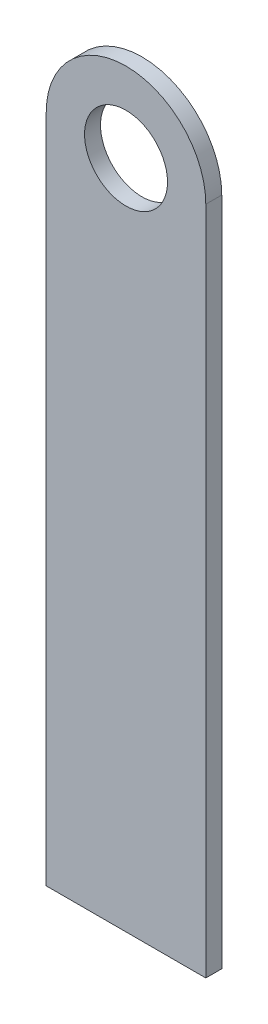
ISO-10303-21;
HEADER;
FILE_DESCRIPTION(('STEP AP214'),'2;1');
FILE_NAME('part.step','',(''),(''),'','','');
FILE_SCHEMA(('AUTOMOTIVE_DESIGN { 1 0 10303 214 1 1 1 1 }'));
ENDSEC;
DATA;
#1=APPLICATION_CONTEXT('core data for automotive mechanical design processes');
#2=APPLICATION_PROTOCOL_DEFINITION('international standard','automotive_design',2000,#1);
#3=PRODUCT_CONTEXT('',#1,'mechanical');
#4=PRODUCT('Part','Part','',(#3));
#5=PRODUCT_RELATED_PRODUCT_CATEGORY('part','',(#4));
#6=PRODUCT_DEFINITION_FORMATION('','',#4);
#7=PRODUCT_DEFINITION_CONTEXT('part definition',#1,'design');
#8=PRODUCT_DEFINITION('design','',#6,#7);
#9=PRODUCT_DEFINITION_SHAPE('','',#8);
#10=(LENGTH_UNIT() NAMED_UNIT(*) SI_UNIT(.MILLI.,.METRE.));
#11=(NAMED_UNIT(*) PLANE_ANGLE_UNIT() SI_UNIT($,.RADIAN.));
#12=(NAMED_UNIT(*) SI_UNIT($,.STERADIAN.) SOLID_ANGLE_UNIT());
#13=UNCERTAINTY_MEASURE_WITH_UNIT(LENGTH_MEASURE(1.E-05),#10,'distance_accuracy_value','');
#14=(GEOMETRIC_REPRESENTATION_CONTEXT(3) GLOBAL_UNCERTAINTY_ASSIGNED_CONTEXT((#13)) GLOBAL_UNIT_ASSIGNED_CONTEXT((#10,
#11,#12)) REPRESENTATION_CONTEXT('',''));
#15=CARTESIAN_POINT('',(0.,0.,0.));
#16=DIRECTION('',(0.,0.,1.));
#17=DIRECTION('',(1.,0.,0.));
#18=AXIS2_PLACEMENT_3D('',#15,#16,#17);
#19=CARTESIAN_POINT('',(25.,210.,5.));
#20=DIRECTION('',(0.,0.,-1.));
#21=DIRECTION('',(-1.,0.,0.));
#22=AXIS2_PLACEMENT_3D('',#19,#20,#21);
#23=PLANE('',#22);
#24=DIRECTION('',(1.,0.,0.));
#25=VECTOR('',#24,1.);
#26=CARTESIAN_POINT('',(50.,0.,5.));
#27=LINE('',#26,#25);
#28=CARTESIAN_POINT('',(0.,0.,5.));
#29=VERTEX_POINT('',#28);
#30=CARTESIAN_POINT('',(50.,0.,5.));
#31=VERTEX_POINT('',#30);
#32=EDGE_CURVE('E89',#29,#31,#27,.T.);
#33=ORIENTED_EDGE('',*,*,#32,.T.);
#34=DIRECTION('',(0.,1.,0.));
#35=VECTOR('',#34,1.);
#36=CARTESIAN_POINT('',(50.,210.,5.));
#37=LINE('',#36,#35);
#38=CARTESIAN_POINT('',(50.,210.,5.));
#39=VERTEX_POINT('',#38);
#40=EDGE_CURVE('E84',#31,#39,#37,.T.);
#41=ORIENTED_EDGE('',*,*,#40,.T.);
#42=CARTESIAN_POINT('',(25.,210.,5.));
#43=DIRECTION('',(0.,0.,1.));
#44=DIRECTION('',(-1.,0.,0.));
#45=AXIS2_PLACEMENT_3D('',#42,#43,#44);
#46=CIRCLE('',#45,25.);
#47=CARTESIAN_POINT('',(0.,210.,5.));
#48=VERTEX_POINT('',#47);
#49=EDGE_CURVE('E87',#39,#48,#46,.T.);
#50=ORIENTED_EDGE('',*,*,#49,.T.);
#51=DIRECTION('',(0.,-1.,0.));
#52=VECTOR('',#51,1.);
#53=CARTESIAN_POINT('',(0.,0.,5.));
#54=LINE('',#53,#52);
#55=EDGE_CURVE('E54',#48,#29,#54,.T.);
#56=ORIENTED_EDGE('',*,*,#55,.T.);
#57=EDGE_LOOP('',(#33,#41,#50,#56));
#58=FACE_BOUND('',#57,.T.);
#59=CARTESIAN_POINT('',(25.,210.,5.));
#60=DIRECTION('',(0.,0.,1.));
#61=DIRECTION('',(1.,0.,0.));
#62=AXIS2_PLACEMENT_3D('',#59,#60,#61);
#63=CIRCLE('',#62,13.);
#64=CARTESIAN_POINT('',(38.,210.,5.));
#65=VERTEX_POINT('',#64);
#66=EDGE_CURVE('E104',#65,#65,#63,.T.);
#67=ORIENTED_EDGE('',*,*,#66,.F.);
#68=EDGE_LOOP('',(#67));
#69=FACE_BOUND('',#68,.T.);
#70=ADVANCED_FACE('F37',(#58,#69),#23,.F.);
#71=CARTESIAN_POINT('',(25.,210.,0.));
#72=DIRECTION('',(0.,0.,-1.));
#73=DIRECTION('',(-1.,0.,0.));
#74=AXIS2_PLACEMENT_3D('',#71,#72,#73);
#75=PLANE('',#74);
#76=DIRECTION('',(1.,0.,0.));
#77=VECTOR('',#76,1.);
#78=CARTESIAN_POINT('',(50.,0.,0.));
#79=LINE('',#78,#77);
#80=CARTESIAN_POINT('',(0.,0.,0.));
#81=VERTEX_POINT('',#80);
#82=CARTESIAN_POINT('',(50.,0.,0.));
#83=VERTEX_POINT('',#82);
#84=EDGE_CURVE('E101',#81,#83,#79,.T.);
#85=ORIENTED_EDGE('',*,*,#84,.F.);
#86=DIRECTION('',(0.,-1.,0.));
#87=VECTOR('',#86,1.);
#88=CARTESIAN_POINT('',(0.,0.,0.));
#89=LINE('',#88,#87);
#90=CARTESIAN_POINT('',(0.,210.,0.));
#91=VERTEX_POINT('',#90);
#92=EDGE_CURVE('E77',#91,#81,#89,.T.);
#93=ORIENTED_EDGE('',*,*,#92,.F.);
#94=CARTESIAN_POINT('',(25.,210.,0.));
#95=DIRECTION('',(0.,0.,1.));
#96=DIRECTION('',(-1.,0.,0.));
#97=AXIS2_PLACEMENT_3D('',#94,#95,#96);
#98=CIRCLE('',#97,25.);
#99=CARTESIAN_POINT('',(50.,210.,0.));
#100=VERTEX_POINT('',#99);
#101=EDGE_CURVE('E71',#100,#91,#98,.T.);
#102=ORIENTED_EDGE('',*,*,#101,.F.);
#103=DIRECTION('',(0.,1.,0.));
#104=VECTOR('',#103,1.);
#105=CARTESIAN_POINT('',(50.,210.,0.));
#106=LINE('',#105,#104);
#107=EDGE_CURVE('E93',#83,#100,#106,.T.);
#108=ORIENTED_EDGE('',*,*,#107,.F.);
#109=EDGE_LOOP('',(#85,#93,#102,#108));
#110=FACE_BOUND('',#109,.T.);
#111=CARTESIAN_POINT('',(25.,210.,0.));
#112=DIRECTION('',(0.,0.,1.));
#113=DIRECTION('',(1.,0.,0.));
#114=AXIS2_PLACEMENT_3D('',#111,#112,#113);
#115=CIRCLE('',#114,13.);
#116=CARTESIAN_POINT('',(38.,210.,0.));
#117=VERTEX_POINT('',#116);
#118=EDGE_CURVE('E116',#117,#117,#115,.T.);
#119=ORIENTED_EDGE('',*,*,#118,.T.);
#120=EDGE_LOOP('',(#119));
#121=FACE_BOUND('',#120,.T.);
#122=ADVANCED_FACE('F112',(#110,#121),#75,.T.);
#123=CARTESIAN_POINT('',(50.,0.,5.));
#124=DIRECTION('',(0.,1.,0.));
#125=DIRECTION('',(0.,0.,1.));
#126=AXIS2_PLACEMENT_3D('',#123,#124,#125);
#127=PLANE('',#126);
#128=ORIENTED_EDGE('',*,*,#84,.T.);
#129=DIRECTION('',(0.,0.,-1.));
#130=VECTOR('',#129,1.);
#131=CARTESIAN_POINT('',(50.,0.,5.));
#132=LINE('',#131,#130);
#133=EDGE_CURVE('E11',#31,#83,#132,.T.);
#134=ORIENTED_EDGE('',*,*,#133,.F.);
#135=ORIENTED_EDGE('',*,*,#32,.F.);
#136=DIRECTION('',(0.,0.,-1.));
#137=VECTOR('',#136,1.);
#138=CARTESIAN_POINT('',(0.,0.,5.));
#139=LINE('',#138,#137);
#140=EDGE_CURVE('E97',#29,#81,#139,.T.);
#141=ORIENTED_EDGE('',*,*,#140,.T.);
#142=EDGE_LOOP('',(#128,#134,#135,#141));
#143=FACE_BOUND('',#142,.T.);
#144=ADVANCED_FACE('F39',(#143),#127,.F.);
#145=CARTESIAN_POINT('',(50.,210.,5.));
#146=DIRECTION('',(-1.,0.,0.));
#147=DIRECTION('',(0.,-1.,0.));
#148=AXIS2_PLACEMENT_3D('',#145,#146,#147);
#149=PLANE('',#148);
#150=ORIENTED_EDGE('',*,*,#107,.T.);
#151=DIRECTION('',(0.,0.,-1.));
#152=VECTOR('',#151,1.);
#153=CARTESIAN_POINT('',(50.,210.,5.));
#154=LINE('',#153,#152);
#155=EDGE_CURVE('E46',#39,#100,#154,.T.);
#156=ORIENTED_EDGE('',*,*,#155,.F.);
#157=ORIENTED_EDGE('',*,*,#40,.F.);
#158=ORIENTED_EDGE('',*,*,#133,.T.);
#159=EDGE_LOOP('',(#150,#156,#157,#158));
#160=FACE_BOUND('',#159,.T.);
#161=ADVANCED_FACE('F92',(#160),#149,.F.);
#162=CARTESIAN_POINT('',(25.,210.,5.));
#163=DIRECTION('',(0.,0.,-1.));
#164=DIRECTION('',(-1.,0.,0.));
#165=AXIS2_PLACEMENT_3D('',#162,#163,#164);
#166=CYLINDRICAL_SURFACE('',#165,25.);
#167=ORIENTED_EDGE('',*,*,#101,.T.);
#168=DIRECTION('',(0.,0.,-1.));
#169=VECTOR('',#168,1.);
#170=CARTESIAN_POINT('',(0.,210.,5.));
#171=LINE('',#170,#169);
#172=EDGE_CURVE('E94',#48,#91,#171,.T.);
#173=ORIENTED_EDGE('',*,*,#172,.F.);
#174=ORIENTED_EDGE('',*,*,#49,.F.);
#175=ORIENTED_EDGE('',*,*,#155,.T.);
#176=EDGE_LOOP('',(#167,#173,#174,#175));
#177=FACE_BOUND('',#176,.T.);
#178=ADVANCED_FACE('F95',(#177),#166,.T.);
#179=CARTESIAN_POINT('',(0.,0.,5.));
#180=DIRECTION('',(1.,0.,0.));
#181=DIRECTION('',(0.,0.,-1.));
#182=AXIS2_PLACEMENT_3D('',#179,#180,#181);
#183=PLANE('',#182);
#184=ORIENTED_EDGE('',*,*,#92,.T.);
#185=ORIENTED_EDGE('',*,*,#140,.F.);
#186=ORIENTED_EDGE('',*,*,#55,.F.);
#187=ORIENTED_EDGE('',*,*,#172,.T.);
#188=EDGE_LOOP('',(#184,#185,#186,#187));
#189=FACE_BOUND('',#188,.T.);
#190=ADVANCED_FACE('F109',(#189),#183,.F.);
#191=CARTESIAN_POINT('',(25.,210.,5.));
#192=DIRECTION('',(0.,0.,-1.));
#193=DIRECTION('',(-1.,0.,0.));
#194=AXIS2_PLACEMENT_3D('',#191,#192,#193);
#195=CYLINDRICAL_SURFACE('',#194,13.);
#196=ORIENTED_EDGE('',*,*,#66,.T.);
#197=EDGE_LOOP('',(#196));
#198=FACE_BOUND('',#197,.T.);
#199=ORIENTED_EDGE('',*,*,#118,.F.);
#200=EDGE_LOOP('',(#199));
#201=FACE_BOUND('',#200,.T.);
#202=ADVANCED_FACE('F122',(#198,#201),#195,.F.);
#203=CLOSED_SHELL('',(#70,#122,#144,#161,#178,#190,#202));
#204=MANIFOLD_SOLID_BREP('B2',#203);
#205=ADVANCED_BREP_SHAPE_REPRESENTATION('',(#18,#204),#14);
#206=SHAPE_DEFINITION_REPRESENTATION(#9,#205);
ENDSEC;
END-ISO-10303-21;
